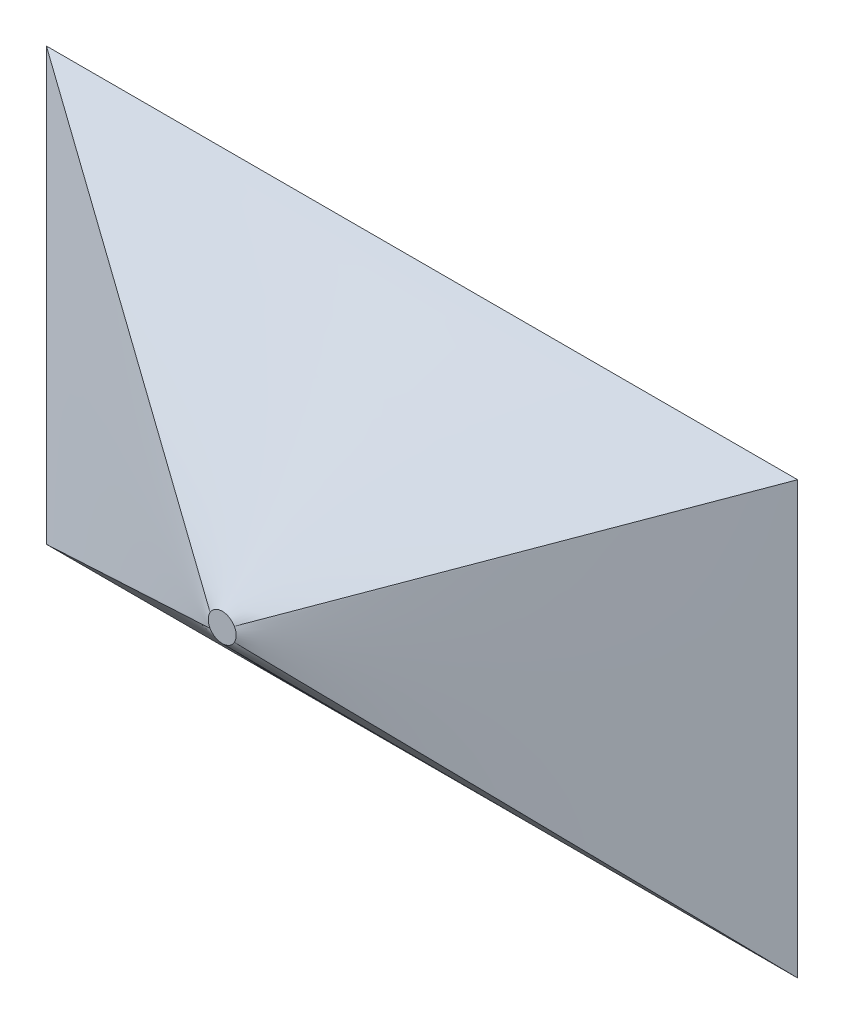
ISO-10303-21;
HEADER;
FILE_DESCRIPTION(('STEP AP214'),'2;1');
FILE_NAME('part.step','',(''),(''),'','','');
FILE_SCHEMA(('AUTOMOTIVE_DESIGN { 1 0 10303 214 1 1 1 1 }'));
ENDSEC;
DATA;
#1=APPLICATION_CONTEXT('core data for automotive mechanical design processes');
#2=APPLICATION_PROTOCOL_DEFINITION('international standard','automotive_design',2000,#1);
#3=PRODUCT_CONTEXT('',#1,'mechanical');
#4=PRODUCT('Part','Part','',(#3));
#5=PRODUCT_RELATED_PRODUCT_CATEGORY('part','',(#4));
#6=PRODUCT_DEFINITION_FORMATION('','',#4);
#7=PRODUCT_DEFINITION_CONTEXT('part definition',#1,'design');
#8=PRODUCT_DEFINITION('design','',#6,#7);
#9=PRODUCT_DEFINITION_SHAPE('','',#8);
#10=(LENGTH_UNIT() NAMED_UNIT(*) SI_UNIT(.MILLI.,.METRE.));
#11=(NAMED_UNIT(*) PLANE_ANGLE_UNIT() SI_UNIT($,.RADIAN.));
#12=(NAMED_UNIT(*) SI_UNIT($,.STERADIAN.) SOLID_ANGLE_UNIT());
#13=UNCERTAINTY_MEASURE_WITH_UNIT(LENGTH_MEASURE(1.E-05),#10,'distance_accuracy_value','');
#14=(GEOMETRIC_REPRESENTATION_CONTEXT(3) GLOBAL_UNCERTAINTY_ASSIGNED_CONTEXT((#13)) GLOBAL_UNIT_ASSIGNED_CONTEXT((#10,
#11,#12)) REPRESENTATION_CONTEXT('',''));
#15=CARTESIAN_POINT('',(0.,0.,0.));
#16=DIRECTION('',(0.,0.,1.));
#17=DIRECTION('',(1.,0.,0.));
#18=AXIS2_PLACEMENT_3D('',#15,#16,#17);
#19=CARTESIAN_POINT('',(0.,0.,0.));
#20=DIRECTION('',(0.,0.,1.));
#21=DIRECTION('',(1.,0.,0.));
#22=AXIS2_PLACEMENT_3D('',#19,#20,#21);
#23=PLANE('',#22);
#24=DIRECTION('',(0.,1.,0.));
#25=VECTOR('',#24,1.);
#26=CARTESIAN_POINT('',(188.,108.,0.));
#27=LINE('',#26,#25);
#28=CARTESIAN_POINT('',(188.,-108.,0.));
#29=VERTEX_POINT('',#28);
#30=CARTESIAN_POINT('',(188.,108.,0.));
#31=VERTEX_POINT('',#30);
#32=EDGE_CURVE('E116',#29,#31,#27,.T.);
#33=ORIENTED_EDGE('',*,*,#32,.F.);
#34=DIRECTION('',(1.,0.,0.));
#35=VECTOR('',#34,1.);
#36=CARTESIAN_POINT('',(-188.,-108.,0.));
#37=LINE('',#36,#35);
#38=CARTESIAN_POINT('',(-188.,-108.,0.));
#39=VERTEX_POINT('',#38);
#40=EDGE_CURVE('E265',#39,#29,#37,.T.);
#41=ORIENTED_EDGE('',*,*,#40,.F.);
#42=DIRECTION('',(0.,-1.,0.));
#43=VECTOR('',#42,1.);
#44=CARTESIAN_POINT('',(-188.,108.,0.));
#45=LINE('',#44,#43);
#46=CARTESIAN_POINT('',(-188.,108.,0.));
#47=VERTEX_POINT('',#46);
#48=EDGE_CURVE('E73',#47,#39,#45,.T.);
#49=ORIENTED_EDGE('',*,*,#48,.F.);
#50=DIRECTION('',(-1.,0.,0.));
#51=VECTOR('',#50,1.);
#52=CARTESIAN_POINT('',(-188.,108.,0.));
#53=LINE('',#52,#51);
#54=EDGE_CURVE('E12',#31,#47,#53,.T.);
#55=ORIENTED_EDGE('',*,*,#54,.F.);
#56=EDGE_LOOP('',(#33,#41,#49,#55));
#57=FACE_BOUND('',#56,.T.);
#58=ADVANCED_FACE('F63',(#57),#23,.F.);
#59=CARTESIAN_POINT('',(0.,0.,100.));
#60=DIRECTION('',(0.,0.,1.));
#61=DIRECTION('',(1.,0.,0.));
#62=AXIS2_PLACEMENT_3D('',#59,#60,#61);
#63=PLANE('',#62);
#64=CARTESIAN_POINT('',(0.,0.,100.));
#65=DIRECTION('',(0.,0.,1.));
#66=DIRECTION('',(1.,0.,0.));
#67=AXIS2_PLACEMENT_3D('',#64,#65,#66);
#68=CIRCLE('',#67,7.);
#69=CARTESIAN_POINT('',(6.06973879729538,3.4868712239782,100.));
#70=VERTEX_POINT('',#69);
#71=CARTESIAN_POINT('',(-6.06973879729538,3.4868712239782,100.));
#72=VERTEX_POINT('',#71);
#73=EDGE_CURVE('E121',#70,#72,#68,.T.);
#74=ORIENTED_EDGE('',*,*,#73,.T.);
#75=CARTESIAN_POINT('',(-6.06973879729538,-3.4868712239782,100.));
#76=VERTEX_POINT('',#75);
#77=EDGE_CURVE('E127',#72,#76,#68,.T.);
#78=ORIENTED_EDGE('',*,*,#77,.T.);
#79=CARTESIAN_POINT('',(6.06973879729538,-3.4868712239782,100.));
#80=VERTEX_POINT('',#79);
#81=EDGE_CURVE('E134',#76,#80,#68,.T.);
#82=ORIENTED_EDGE('',*,*,#81,.T.);
#83=EDGE_CURVE('E113',#80,#70,#68,.T.);
#84=ORIENTED_EDGE('',*,*,#83,.T.);
#85=EDGE_LOOP('',(#74,#78,#82,#84));
#86=FACE_BOUND('',#85,.T.);
#87=ADVANCED_FACE('F132',(#86),#63,.T.);
#88=CARTESIAN_POINT('',(-6.06973879729538,-3.4868712239782,100.));
#89=CARTESIAN_POINT('',(-188.,-108.,0.));
#90=CARTESIAN_POINT('',(-6.35922143854793,-2.98295699661264,100.));
#91=CARTESIAN_POINT('',(-188.,-90.,0.));
#92=CARTESIAN_POINT('',(-6.59491418216806,-2.42511712960454,100.));
#93=CARTESIAN_POINT('',(-188.,-72.,0.));
#94=CARTESIAN_POINT('',(-6.915559464279,-1.24463788247181,100.));
#95=CARTESIAN_POINT('',(-188.,-35.9999999999999,0.));
#96=CARTESIAN_POINT('',(-7.,-0.622509216299929,100.));
#97=CARTESIAN_POINT('',(-188.,-17.9999999999999,0.));
#98=CARTESIAN_POINT('',(-7.,0.62250921629993,100.));
#99=CARTESIAN_POINT('',(-188.,18.0000000000001,0.));
#100=CARTESIAN_POINT('',(-6.915559464279,1.24463788247181,100.));
#101=CARTESIAN_POINT('',(-188.,36.0000000000001,0.));
#102=CARTESIAN_POINT('',(-6.59491418216806,2.42511712960454,100.));
#103=CARTESIAN_POINT('',(-188.,72.,0.));
#104=CARTESIAN_POINT('',(-6.35922143854793,2.98295699661264,100.));
#105=CARTESIAN_POINT('',(-188.,90.,0.));
#106=CARTESIAN_POINT('',(-6.06973879729538,3.4868712239782,100.));
#107=CARTESIAN_POINT('',(-188.,108.,0.));
#108=B_SPLINE_SURFACE_WITH_KNOTS('',3,1,((#88,#89),(#90,#91),(#92,#93),(#94,#95),(#96,#97),(#98,
#99),(#100,#101),(#102,#103),(#104,#105),(#106,#107)),.UNSPECIFIED.,.F.,.F.,.F.,(4,2,2,2,4),(2,
2),(0.,0.25,0.5,0.75,1.),(0.,1.),.UNSPECIFIED.);
#109=DIRECTION('',(-0.782746555591269,0.449662914914133,-0.430245386565538));
#110=VECTOR('',#109,1.);
#111=CARTESIAN_POINT('',(-97.0348693986477,55.7434356119891,50.));
#112=LINE('',#111,#110);
#113=EDGE_CURVE('E88',#72,#47,#112,.T.);
#114=DIRECTION('',(0.782746555591269,0.449662914914133,0.430245386565538));
#115=VECTOR('',#114,1.);
#116=CARTESIAN_POINT('',(-97.0348693986477,-55.7434356119891,50.));
#117=LINE('',#116,#115);
#118=EDGE_CURVE('E126',#39,#76,#117,.T.);
#119=ORIENTED_EDGE('',*,*,#77,.F.);
#120=ORIENTED_EDGE('',*,*,#113,.T.);
#121=ORIENTED_EDGE('',*,*,#48,.T.);
#122=ORIENTED_EDGE('',*,*,#118,.T.);
#123=EDGE_LOOP('',(#119,#120,#121,#122));
#124=FACE_BOUND('',#123,.T.);
#125=ADVANCED_FACE('F155',(#124),#108,.T.);
#126=CARTESIAN_POINT('',(-6.06973879729538,3.4868712239782,100.));
#127=CARTESIAN_POINT('',(-188.,108.,0.));
#128=CARTESIAN_POINT('',(-5.8177816836126,3.92546323668525,100.));
#129=CARTESIAN_POINT('',(-172.333333333333,108.,0.));
#130=CARTESIAN_POINT('',(-5.50172054407291,4.36507863847112,100.));
#131=CARTESIAN_POINT('',(-156.666666666667,108.,0.));
#132=CARTESIAN_POINT('',(-4.72570878572105,5.19523983447057,100.));
#133=CARTESIAN_POINT('',(-125.333333333333,108.,0.));
#134=CARTESIAN_POINT('',(-4.26523579940595,5.58533688424077,100.));
#135=CARTESIAN_POINT('',(-109.666666666667,108.,0.));
#136=CARTESIAN_POINT('',(-3.21168422418766,6.25086465851714,100.));
#137=CARTESIAN_POINT('',(-78.3333333333335,108.,0.));
#138=CARTESIAN_POINT('',(-2.61851653592277,6.52539930603721,100.));
#139=CARTESIAN_POINT('',(-62.6666666666668,108.,0.));
#140=CARTESIAN_POINT('',(-1.34995146530259,6.90036926500744,100.));
#141=CARTESIAN_POINT('',(-31.3333333333335,108.,0.));
#142=CARTESIAN_POINT('',(-0.675259739433668,7.,100.));
#143=CARTESIAN_POINT('',(-15.6666666666668,108.,0.));
#144=CARTESIAN_POINT('',(0.675259739433667,7.,100.));
#145=CARTESIAN_POINT('',(15.6666666666665,108.,0.));
#146=CARTESIAN_POINT('',(1.34995146530259,6.90036926500744,100.));
#147=CARTESIAN_POINT('',(31.3333333333332,108.,0.));
#148=CARTESIAN_POINT('',(2.61851653592277,6.52539930603721,99.9999999999999));
#149=CARTESIAN_POINT('',(62.6666666666665,108.,0.));
#150=CARTESIAN_POINT('',(3.21168422418766,6.25086465851714,100.));
#151=CARTESIAN_POINT('',(78.3333333333332,108.,0.));
#152=CARTESIAN_POINT('',(4.26523579940595,5.58533688424078,100.));
#153=CARTESIAN_POINT('',(109.666666666667,108.,0.));
#154=CARTESIAN_POINT('',(4.72570878572105,5.19523983447057,100.));
#155=CARTESIAN_POINT('',(125.333333333333,108.,0.));
#156=CARTESIAN_POINT('',(5.50172054407291,4.36507863847112,100.));
#157=CARTESIAN_POINT('',(156.666666666667,108.,0.));
#158=CARTESIAN_POINT('',(5.8177816836126,3.92546323668525,100.));
#159=CARTESIAN_POINT('',(172.333333333333,108.,0.));
#160=CARTESIAN_POINT('',(6.06973879729538,3.4868712239782,100.));
#161=CARTESIAN_POINT('',(188.,108.,0.));
#162=B_SPLINE_SURFACE_WITH_KNOTS('',3,1,((#126,#127),(#128,#129),(#130,#131),(#132,#133),(#134,
#135),(#136,#137),(#138,#139),(#140,#141),(#142,#143),(#144,#145),(#146,#147),(#148,#149),(#150,
#151),(#152,#153),(#154,#155),(#156,#157),(#158,#159),(#160,#161)),.UNSPECIFIED.,.F.,.F.,.F.,(4,
2,2,2,2,2,2,2,4),(2,2),(0.,0.125,0.25,0.375,0.5,0.625,0.75,0.875,1.),(0.,1.),.UNSPECIFIED.);
#163=DIRECTION('',(0.782746555591269,0.449662914914133,-0.430245386565538));
#164=VECTOR('',#163,1.);
#165=CARTESIAN_POINT('',(97.0348693986477,55.7434356119891,50.));
#166=LINE('',#165,#164);
#167=EDGE_CURVE('E108',#70,#31,#166,.T.);
#168=ORIENTED_EDGE('',*,*,#73,.F.);
#169=ORIENTED_EDGE('',*,*,#167,.T.);
#170=ORIENTED_EDGE('',*,*,#54,.T.);
#171=ORIENTED_EDGE('',*,*,#113,.F.);
#172=EDGE_LOOP('',(#168,#169,#170,#171));
#173=FACE_BOUND('',#172,.T.);
#174=ADVANCED_FACE('F123',(#173),#162,.T.);
#175=CARTESIAN_POINT('',(6.06973879729538,-3.4868712239782,100.));
#176=CARTESIAN_POINT('',(188.,-108.,0.));
#177=CARTESIAN_POINT('',(5.8177816836126,-3.92546323668525,100.));
#178=CARTESIAN_POINT('',(172.333333333333,-108.,0.));
#179=CARTESIAN_POINT('',(5.50172054407291,-4.36507863847112,100.));
#180=CARTESIAN_POINT('',(156.666666666667,-108.,0.));
#181=CARTESIAN_POINT('',(4.72570878572105,-5.19523983447057,100.));
#182=CARTESIAN_POINT('',(125.333333333333,-108.,0.));
#183=CARTESIAN_POINT('',(4.26523579940595,-5.58533688424078,100.));
#184=CARTESIAN_POINT('',(109.666666666667,-108.,0.));
#185=CARTESIAN_POINT('',(3.21168422418766,-6.25086465851714,100.));
#186=CARTESIAN_POINT('',(78.3333333333334,-108.,0.));
#187=CARTESIAN_POINT('',(2.61851653592277,-6.52539930603721,100.));
#188=CARTESIAN_POINT('',(62.6666666666667,-108.,0.));
#189=CARTESIAN_POINT('',(1.34995146530259,-6.90036926500744,100.));
#190=CARTESIAN_POINT('',(31.3333333333334,-108.,0.));
#191=CARTESIAN_POINT('',(0.675259739433666,-7.,100.));
#192=CARTESIAN_POINT('',(15.6666666666667,-108.,0.));
#193=CARTESIAN_POINT('',(-0.675259739433669,-7.,100.));
#194=CARTESIAN_POINT('',(-15.6666666666666,-108.,0.));
#195=CARTESIAN_POINT('',(-1.34995146530259,-6.90036926500744,100.));
#196=CARTESIAN_POINT('',(-31.3333333333333,-108.,0.));
#197=CARTESIAN_POINT('',(-2.61851653592277,-6.52539930603721,100.));
#198=CARTESIAN_POINT('',(-62.6666666666667,-108.,0.));
#199=CARTESIAN_POINT('',(-3.21168422418766,-6.25086465851714,100.));
#200=CARTESIAN_POINT('',(-78.3333333333334,-108.,0.));
#201=CARTESIAN_POINT('',(-4.26523579940595,-5.58533688424077,100.));
#202=CARTESIAN_POINT('',(-109.666666666667,-108.,0.));
#203=CARTESIAN_POINT('',(-4.72570878572105,-5.19523983447057,100.));
#204=CARTESIAN_POINT('',(-125.333333333333,-108.,0.));
#205=CARTESIAN_POINT('',(-5.50172054407292,-4.36507863847113,100.));
#206=CARTESIAN_POINT('',(-156.666666666667,-108.,0.));
#207=CARTESIAN_POINT('',(-5.81778168361261,-3.92546323668525,100.));
#208=CARTESIAN_POINT('',(-172.333333333333,-108.,0.));
#209=CARTESIAN_POINT('',(-6.06973879729538,-3.48687122397819,100.));
#210=CARTESIAN_POINT('',(-188.,-108.,0.));
#211=B_SPLINE_SURFACE_WITH_KNOTS('',3,1,((#175,#176),(#177,#178),(#179,#180),(#181,#182),(#183,
#184),(#185,#186),(#187,#188),(#189,#190),(#191,#192),(#193,#194),(#195,#196),(#197,#198),(#199,
#200),(#201,#202),(#203,#204),(#205,#206),(#207,#208),(#209,#210)),.UNSPECIFIED.,.F.,.F.,.F.,(4,
2,2,2,2,2,2,2,4),(2,2),(0.,0.125,0.25,0.375,0.5,0.625,0.75,0.875,1.),(0.,1.),.UNSPECIFIED.);
#212=DIRECTION('',(0.782746555591269,-0.449662914914133,-0.430245386565538));
#213=VECTOR('',#212,1.);
#214=CARTESIAN_POINT('',(97.0348693986477,-55.7434356119891,50.));
#215=LINE('',#214,#213);
#216=EDGE_CURVE('E119',#80,#29,#215,.T.);
#217=ORIENTED_EDGE('',*,*,#81,.F.);
#218=ORIENTED_EDGE('',*,*,#118,.F.);
#219=ORIENTED_EDGE('',*,*,#40,.T.);
#220=ORIENTED_EDGE('',*,*,#216,.F.);
#221=EDGE_LOOP('',(#217,#218,#219,#220));
#222=FACE_BOUND('',#221,.T.);
#223=ADVANCED_FACE('F189',(#222),#211,.T.);
#224=CARTESIAN_POINT('',(6.06973879729538,3.4868712239782,100.));
#225=CARTESIAN_POINT('',(188.,108.,0.));
#226=CARTESIAN_POINT('',(6.35922143854793,2.98295699661264,100.));
#227=CARTESIAN_POINT('',(188.,90.,0.));
#228=CARTESIAN_POINT('',(6.59491418216806,2.42511712960454,100.));
#229=CARTESIAN_POINT('',(188.,72.,0.));
#230=CARTESIAN_POINT('',(6.915559464279,1.24463788247181,100.));
#231=CARTESIAN_POINT('',(188.,35.9999999999999,0.));
#232=CARTESIAN_POINT('',(7.,0.622509216299928,100.));
#233=CARTESIAN_POINT('',(188.,17.9999999999999,0.));
#234=CARTESIAN_POINT('',(7.,-0.62250921629993,100.));
#235=CARTESIAN_POINT('',(188.,-18.0000000000001,0.));
#236=CARTESIAN_POINT('',(6.915559464279,-1.24463788247181,100.));
#237=CARTESIAN_POINT('',(188.,-36.0000000000001,0.));
#238=CARTESIAN_POINT('',(6.59491418216806,-2.42511712960454,100.));
#239=CARTESIAN_POINT('',(188.,-72.0000000000001,0.));
#240=CARTESIAN_POINT('',(6.35922143854793,-2.98295699661264,100.));
#241=CARTESIAN_POINT('',(188.,-90.,0.));
#242=CARTESIAN_POINT('',(6.06973879729538,-3.4868712239782,100.));
#243=CARTESIAN_POINT('',(188.,-108.,0.));
#244=B_SPLINE_SURFACE_WITH_KNOTS('',3,1,((#224,#225),(#226,#227),(#228,#229),(#230,#231),(#232,
#233),(#234,#235),(#236,#237),(#238,#239),(#240,#241),(#242,#243)),.UNSPECIFIED.,.F.,.F.,.F.,(4,
2,2,2,4),(2,2),(0.,0.25,0.5,0.75,1.),(0.,1.),.UNSPECIFIED.);
#245=ORIENTED_EDGE('',*,*,#83,.F.);
#246=ORIENTED_EDGE('',*,*,#216,.T.);
#247=ORIENTED_EDGE('',*,*,#32,.T.);
#248=ORIENTED_EDGE('',*,*,#167,.F.);
#249=EDGE_LOOP('',(#245,#246,#247,#248));
#250=FACE_BOUND('',#249,.T.);
#251=ADVANCED_FACE('F110',(#250),#244,.T.);
#252=CLOSED_SHELL('',(#58,#87,#125,#174,#223,#251));
#253=MANIFOLD_SOLID_BREP('B2',#252);
#254=ADVANCED_BREP_SHAPE_REPRESENTATION('',(#18,#253),#14);
#255=SHAPE_DEFINITION_REPRESENTATION(#9,#254);
ENDSEC;
END-ISO-10303-21;
